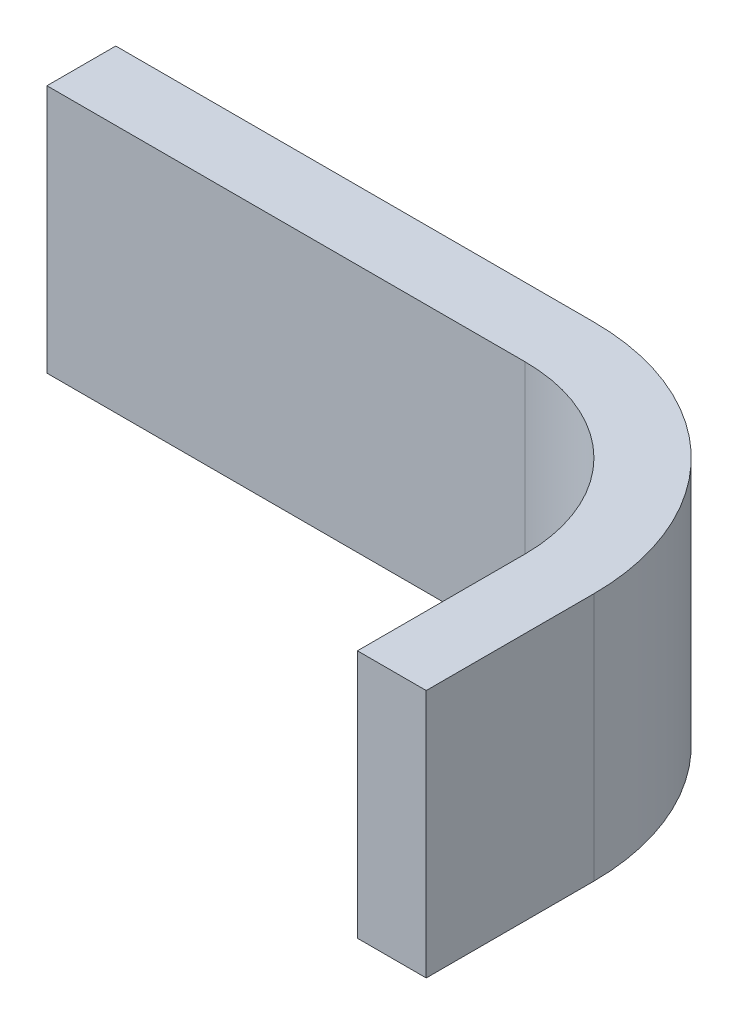
ISO-10303-21;
HEADER;
FILE_DESCRIPTION(('STEP AP214'),'2;1');
FILE_NAME('part.step','',(''),(''),'','','');
FILE_SCHEMA(('AUTOMOTIVE_DESIGN { 1 0 10303 214 1 1 1 1 }'));
ENDSEC;
DATA;
#1=APPLICATION_CONTEXT('core data for automotive mechanical design processes');
#2=APPLICATION_PROTOCOL_DEFINITION('international standard','automotive_design',2000,#1);
#3=PRODUCT_CONTEXT('',#1,'mechanical');
#4=PRODUCT('Part','Part','',(#3));
#5=PRODUCT_RELATED_PRODUCT_CATEGORY('part','',(#4));
#6=PRODUCT_DEFINITION_FORMATION('','',#4);
#7=PRODUCT_DEFINITION_CONTEXT('part definition',#1,'design');
#8=PRODUCT_DEFINITION('design','',#6,#7);
#9=PRODUCT_DEFINITION_SHAPE('','',#8);
#10=(LENGTH_UNIT() NAMED_UNIT(*) SI_UNIT(.MILLI.,.METRE.));
#11=(NAMED_UNIT(*) PLANE_ANGLE_UNIT() SI_UNIT($,.RADIAN.));
#12=(NAMED_UNIT(*) SI_UNIT($,.STERADIAN.) SOLID_ANGLE_UNIT());
#13=UNCERTAINTY_MEASURE_WITH_UNIT(LENGTH_MEASURE(1.E-05),#10,'distance_accuracy_value','');
#14=(GEOMETRIC_REPRESENTATION_CONTEXT(3) GLOBAL_UNCERTAINTY_ASSIGNED_CONTEXT((#13)) GLOBAL_UNIT_ASSIGNED_CONTEXT((#10,
#11,#12)) REPRESENTATION_CONTEXT('',''));
#15=CARTESIAN_POINT('',(0.,0.,0.));
#16=DIRECTION('',(0.,0.,1.));
#17=DIRECTION('',(1.,0.,0.));
#18=AXIS2_PLACEMENT_3D('',#15,#16,#17);
#19=CARTESIAN_POINT('',(0.,34.925,0.));
#20=DIRECTION('',(0.,0.,-1.));
#21=DIRECTION('',(-1.,0.,0.));
#22=AXIS2_PLACEMENT_3D('',#19,#20,#21);
#23=PLANE('',#22);
#24=DIRECTION('',(1.,0.,0.));
#25=VECTOR('',#24,1.);
#26=CARTESIAN_POINT('',(0.,0.,0.));
#27=LINE('',#26,#25);
#28=CARTESIAN_POINT('',(0.,0.,0.));
#29=VERTEX_POINT('',#28);
#30=CARTESIAN_POINT('',(67.05600012,0.,0.));
#31=VERTEX_POINT('',#30);
#32=EDGE_CURVE('E114',#29,#31,#27,.T.);
#33=ORIENTED_EDGE('',*,*,#32,.T.);
#34=DIRECTION('',(0.,-1.,0.));
#35=VECTOR('',#34,1.);
#36=CARTESIAN_POINT('',(67.05600012,34.925,0.));
#37=LINE('',#36,#35);
#38=CARTESIAN_POINT('',(67.05600012,34.925,0.));
#39=VERTEX_POINT('',#38);
#40=EDGE_CURVE('E11',#39,#31,#37,.T.);
#41=ORIENTED_EDGE('',*,*,#40,.F.);
#42=DIRECTION('',(1.,0.,0.));
#43=VECTOR('',#42,1.);
#44=CARTESIAN_POINT('',(0.,34.925,0.));
#45=LINE('',#44,#43);
#46=CARTESIAN_POINT('',(0.,34.925,0.));
#47=VERTEX_POINT('',#46);
#48=EDGE_CURVE('E133',#47,#39,#45,.T.);
#49=ORIENTED_EDGE('',*,*,#48,.F.);
#50=DIRECTION('',(0.,-1.,0.));
#51=VECTOR('',#50,1.);
#52=CARTESIAN_POINT('',(0.,34.925,0.));
#53=LINE('',#52,#51);
#54=EDGE_CURVE('E33',#47,#29,#53,.T.);
#55=ORIENTED_EDGE('',*,*,#54,.T.);
#56=EDGE_LOOP('',(#33,#41,#49,#55));
#57=FACE_BOUND('',#56,.T.);
#58=ADVANCED_FACE('F17',(#57),#23,.F.);
#59=CARTESIAN_POINT('',(67.05600012,34.925,23.368));
#60=DIRECTION('',(0.,-1.,0.));
#61=DIRECTION('',(0.,0.,-1.));
#62=AXIS2_PLACEMENT_3D('',#59,#60,#61);
#63=CYLINDRICAL_SURFACE('',#62,23.368);
#64=CARTESIAN_POINT('',(67.05600012,0.,23.368));
#65=DIRECTION('',(0.,1.,0.));
#66=DIRECTION('',(0.,0.,1.));
#67=AXIS2_PLACEMENT_3D('',#64,#65,#66);
#68=CIRCLE('',#67,23.368);
#69=CARTESIAN_POINT('',(90.42400012,0.,23.368));
#70=VERTEX_POINT('',#69);
#71=EDGE_CURVE('E116',#31,#70,#68,.F.);
#72=ORIENTED_EDGE('',*,*,#71,.T.);
#73=DIRECTION('',(0.,-1.,0.));
#74=VECTOR('',#73,1.);
#75=CARTESIAN_POINT('',(90.42400012,34.925,23.368));
#76=LINE('',#75,#74);
#77=CARTESIAN_POINT('',(90.42400012,34.925,23.368));
#78=VERTEX_POINT('',#77);
#79=EDGE_CURVE('E25',#78,#70,#76,.T.);
#80=ORIENTED_EDGE('',*,*,#79,.F.);
#81=CARTESIAN_POINT('',(67.05600012,34.925,23.368));
#82=DIRECTION('',(0.,1.,0.));
#83=DIRECTION('',(0.,0.,1.));
#84=AXIS2_PLACEMENT_3D('',#81,#82,#83);
#85=CIRCLE('',#84,23.368);
#86=EDGE_CURVE('E71',#39,#78,#85,.F.);
#87=ORIENTED_EDGE('',*,*,#86,.F.);
#88=ORIENTED_EDGE('',*,*,#40,.T.);
#89=EDGE_LOOP('',(#72,#80,#87,#88));
#90=FACE_BOUND('',#89,.T.);
#91=ADVANCED_FACE('F160',(#90),#63,.F.);
#92=CARTESIAN_POINT('',(90.42400012,34.925,0.));
#93=DIRECTION('',(1.,0.,0.));
#94=DIRECTION('',(0.,0.,-1.));
#95=AXIS2_PLACEMENT_3D('',#92,#93,#94);
#96=PLANE('',#95);
#97=DIRECTION('',(0.,0.,1.));
#98=VECTOR('',#97,1.);
#99=CARTESIAN_POINT('',(90.42400012,0.,0.));
#100=LINE('',#99,#98);
#101=CARTESIAN_POINT('',(90.42400012,0.,46.8722));
#102=VERTEX_POINT('',#101);
#103=EDGE_CURVE('E118',#70,#102,#100,.T.);
#104=ORIENTED_EDGE('',*,*,#103,.T.);
#105=DIRECTION('',(0.,-1.,0.));
#106=VECTOR('',#105,1.);
#107=CARTESIAN_POINT('',(90.42400012,34.925,46.8722));
#108=LINE('',#107,#106);
#109=CARTESIAN_POINT('',(90.42400012,34.925,46.8722));
#110=VERTEX_POINT('',#109);
#111=EDGE_CURVE('E139',#110,#102,#108,.T.);
#112=ORIENTED_EDGE('',*,*,#111,.F.);
#113=DIRECTION('',(0.,0.,1.));
#114=VECTOR('',#113,1.);
#115=CARTESIAN_POINT('',(90.42400012,34.925,0.));
#116=LINE('',#115,#114);
#117=EDGE_CURVE('E146',#78,#110,#116,.T.);
#118=ORIENTED_EDGE('',*,*,#117,.F.);
#119=ORIENTED_EDGE('',*,*,#79,.T.);
#120=EDGE_LOOP('',(#104,#112,#118,#119));
#121=FACE_BOUND('',#120,.T.);
#122=ADVANCED_FACE('F144',(#121),#96,.F.);
#123=CARTESIAN_POINT('',(0.,34.925,46.8722));
#124=DIRECTION('',(0.,0.,1.));
#125=DIRECTION('',(1.,0.,0.));
#126=AXIS2_PLACEMENT_3D('',#123,#124,#125);
#127=PLANE('',#126);
#128=DIRECTION('',(-1.,0.,0.));
#129=VECTOR('',#128,1.);
#130=CARTESIAN_POINT('',(0.,0.,46.8722));
#131=LINE('',#130,#129);
#132=CARTESIAN_POINT('',(100.07600012,0.,46.8722));
#133=VERTEX_POINT('',#132);
#134=EDGE_CURVE('E121',#133,#102,#131,.T.);
#135=ORIENTED_EDGE('',*,*,#134,.F.);
#136=DIRECTION('',(0.,-1.,0.));
#137=VECTOR('',#136,1.);
#138=CARTESIAN_POINT('',(100.07600012,34.925,46.8722));
#139=LINE('',#138,#137);
#140=CARTESIAN_POINT('',(100.07600012,34.925,46.8722));
#141=VERTEX_POINT('',#140);
#142=EDGE_CURVE('E137',#141,#133,#139,.T.);
#143=ORIENTED_EDGE('',*,*,#142,.F.);
#144=DIRECTION('',(-1.,0.,0.));
#145=VECTOR('',#144,1.);
#146=CARTESIAN_POINT('',(0.,34.925,46.8722));
#147=LINE('',#146,#145);
#148=EDGE_CURVE('E154',#141,#110,#147,.T.);
#149=ORIENTED_EDGE('',*,*,#148,.T.);
#150=ORIENTED_EDGE('',*,*,#111,.T.);
#151=EDGE_LOOP('',(#135,#143,#149,#150));
#152=FACE_BOUND('',#151,.T.);
#153=ADVANCED_FACE('F152',(#152),#127,.T.);
#154=CARTESIAN_POINT('',(100.07600012,34.925,0.));
#155=DIRECTION('',(1.,0.,0.));
#156=DIRECTION('',(0.,0.,-1.));
#157=AXIS2_PLACEMENT_3D('',#154,#155,#156);
#158=PLANE('',#157);
#159=DIRECTION('',(0.,0.,1.));
#160=VECTOR('',#159,1.);
#161=CARTESIAN_POINT('',(100.07600012,0.,0.));
#162=LINE('',#161,#160);
#163=CARTESIAN_POINT('',(100.07600012,0.,23.368));
#164=VERTEX_POINT('',#163);
#165=EDGE_CURVE('E124',#164,#133,#162,.T.);
#166=ORIENTED_EDGE('',*,*,#165,.F.);
#167=DIRECTION('',(0.,-1.,0.));
#168=VECTOR('',#167,1.);
#169=CARTESIAN_POINT('',(100.07600012,34.925,23.368));
#170=LINE('',#169,#168);
#171=CARTESIAN_POINT('',(100.07600012,34.925,23.368));
#172=VERTEX_POINT('',#171);
#173=EDGE_CURVE('E96',#172,#164,#170,.T.);
#174=ORIENTED_EDGE('',*,*,#173,.F.);
#175=DIRECTION('',(0.,0.,1.));
#176=VECTOR('',#175,1.);
#177=CARTESIAN_POINT('',(100.07600012,34.925,0.));
#178=LINE('',#177,#176);
#179=EDGE_CURVE('E106',#172,#141,#178,.T.);
#180=ORIENTED_EDGE('',*,*,#179,.T.);
#181=ORIENTED_EDGE('',*,*,#142,.T.);
#182=EDGE_LOOP('',(#166,#174,#180,#181));
#183=FACE_BOUND('',#182,.T.);
#184=ADVANCED_FACE('F172',(#183),#158,.T.);
#185=CARTESIAN_POINT('',(67.05600012,34.925,23.368));
#186=DIRECTION('',(0.,-1.,0.));
#187=DIRECTION('',(0.,0.,-1.));
#188=AXIS2_PLACEMENT_3D('',#185,#186,#187);
#189=CYLINDRICAL_SURFACE('',#188,33.02);
#190=CARTESIAN_POINT('',(67.05600012,0.,23.368));
#191=DIRECTION('',(0.,1.,0.));
#192=DIRECTION('',(0.,0.,1.));
#193=AXIS2_PLACEMENT_3D('',#190,#191,#192);
#194=CIRCLE('',#193,33.02);
#195=CARTESIAN_POINT('',(67.05600012,0.,-9.652));
#196=VERTEX_POINT('',#195);
#197=EDGE_CURVE('E92',#196,#164,#194,.F.);
#198=ORIENTED_EDGE('',*,*,#197,.F.);
#199=DIRECTION('',(0.,-1.,0.));
#200=VECTOR('',#199,1.);
#201=CARTESIAN_POINT('',(67.05600012,34.925,-9.652));
#202=LINE('',#201,#200);
#203=CARTESIAN_POINT('',(67.05600012,34.925,-9.652));
#204=VERTEX_POINT('',#203);
#205=EDGE_CURVE('E87',#204,#196,#202,.T.);
#206=ORIENTED_EDGE('',*,*,#205,.F.);
#207=CARTESIAN_POINT('',(67.05600012,34.925,23.368));
#208=DIRECTION('',(0.,1.,0.));
#209=DIRECTION('',(0.,0.,1.));
#210=AXIS2_PLACEMENT_3D('',#207,#208,#209);
#211=CIRCLE('',#210,33.02);
#212=EDGE_CURVE('E90',#204,#172,#211,.F.);
#213=ORIENTED_EDGE('',*,*,#212,.T.);
#214=ORIENTED_EDGE('',*,*,#173,.T.);
#215=EDGE_LOOP('',(#198,#206,#213,#214));
#216=FACE_BOUND('',#215,.T.);
#217=ADVANCED_FACE('F89',(#216),#189,.T.);
#218=CARTESIAN_POINT('',(0.,34.925,-9.652));
#219=DIRECTION('',(0.,0.,-1.));
#220=DIRECTION('',(-1.,0.,0.));
#221=AXIS2_PLACEMENT_3D('',#218,#219,#220);
#222=PLANE('',#221);
#223=DIRECTION('',(1.,0.,0.));
#224=VECTOR('',#223,1.);
#225=CARTESIAN_POINT('',(0.,0.,-9.652));
#226=LINE('',#225,#224);
#227=CARTESIAN_POINT('',(0.,0.,-9.652));
#228=VERTEX_POINT('',#227);
#229=EDGE_CURVE('E128',#228,#196,#226,.T.);
#230=ORIENTED_EDGE('',*,*,#229,.F.);
#231=DIRECTION('',(0.,-1.,0.));
#232=VECTOR('',#231,1.);
#233=CARTESIAN_POINT('',(0.,34.925,-9.652));
#234=LINE('',#233,#232);
#235=CARTESIAN_POINT('',(0.,34.925,-9.652));
#236=VERTEX_POINT('',#235);
#237=EDGE_CURVE('E59',#236,#228,#234,.T.);
#238=ORIENTED_EDGE('',*,*,#237,.F.);
#239=DIRECTION('',(1.,0.,0.));
#240=VECTOR('',#239,1.);
#241=CARTESIAN_POINT('',(0.,34.925,-9.652));
#242=LINE('',#241,#240);
#243=EDGE_CURVE('E103',#236,#204,#242,.T.);
#244=ORIENTED_EDGE('',*,*,#243,.T.);
#245=ORIENTED_EDGE('',*,*,#205,.T.);
#246=EDGE_LOOP('',(#230,#238,#244,#245));
#247=FACE_BOUND('',#246,.T.);
#248=ADVANCED_FACE('F108',(#247),#222,.T.);
#249=CARTESIAN_POINT('',(0.,34.925,0.));
#250=DIRECTION('',(-1.,0.,0.));
#251=DIRECTION('',(0.,0.,1.));
#252=AXIS2_PLACEMENT_3D('',#249,#250,#251);
#253=PLANE('',#252);
#254=DIRECTION('',(0.,0.,-1.));
#255=VECTOR('',#254,1.);
#256=CARTESIAN_POINT('',(0.,0.,0.));
#257=LINE('',#256,#255);
#258=EDGE_CURVE('E130',#29,#228,#257,.T.);
#259=ORIENTED_EDGE('',*,*,#258,.F.);
#260=ORIENTED_EDGE('',*,*,#54,.F.);
#261=DIRECTION('',(0.,0.,-1.));
#262=VECTOR('',#261,1.);
#263=CARTESIAN_POINT('',(0.,34.925,0.));
#264=LINE('',#263,#262);
#265=EDGE_CURVE('E109',#47,#236,#264,.T.);
#266=ORIENTED_EDGE('',*,*,#265,.T.);
#267=ORIENTED_EDGE('',*,*,#237,.T.);
#268=EDGE_LOOP('',(#259,#260,#266,#267));
#269=FACE_BOUND('',#268,.T.);
#270=ADVANCED_FACE('F180',(#269),#253,.T.);
#271=CARTESIAN_POINT('',(0.,34.925,0.));
#272=DIRECTION('',(0.,1.,0.));
#273=DIRECTION('',(0.,0.,1.));
#274=AXIS2_PLACEMENT_3D('',#271,#272,#273);
#275=PLANE('',#274);
#276=ORIENTED_EDGE('',*,*,#48,.T.);
#277=ORIENTED_EDGE('',*,*,#86,.T.);
#278=ORIENTED_EDGE('',*,*,#117,.T.);
#279=ORIENTED_EDGE('',*,*,#148,.F.);
#280=ORIENTED_EDGE('',*,*,#179,.F.);
#281=ORIENTED_EDGE('',*,*,#212,.F.);
#282=ORIENTED_EDGE('',*,*,#243,.F.);
#283=ORIENTED_EDGE('',*,*,#265,.F.);
#284=EDGE_LOOP('',(#276,#277,#278,#279,#280,#281,#282,#283));
#285=FACE_BOUND('',#284,.T.);
#286=ADVANCED_FACE('F101',(#285),#275,.T.);
#287=CARTESIAN_POINT('',(0.,0.,0.));
#288=DIRECTION('',(0.,1.,0.));
#289=DIRECTION('',(0.,0.,1.));
#290=AXIS2_PLACEMENT_3D('',#287,#288,#289);
#291=PLANE('',#290);
#292=ORIENTED_EDGE('',*,*,#32,.F.);
#293=ORIENTED_EDGE('',*,*,#258,.T.);
#294=ORIENTED_EDGE('',*,*,#229,.T.);
#295=ORIENTED_EDGE('',*,*,#197,.T.);
#296=ORIENTED_EDGE('',*,*,#165,.T.);
#297=ORIENTED_EDGE('',*,*,#134,.T.);
#298=ORIENTED_EDGE('',*,*,#103,.F.);
#299=ORIENTED_EDGE('',*,*,#71,.F.);
#300=EDGE_LOOP('',(#292,#293,#294,#295,#296,#297,#298,#299));
#301=FACE_BOUND('',#300,.T.);
#302=ADVANCED_FACE('F148',(#301),#291,.F.);
#303=CLOSED_SHELL('',(#58,#91,#122,#153,#184,#217,#248,#270,#286,#302));
#304=MANIFOLD_SOLID_BREP('B1',#303);
#305=ADVANCED_BREP_SHAPE_REPRESENTATION('',(#18,#304),#14);
#306=SHAPE_DEFINITION_REPRESENTATION(#9,#305);
ENDSEC;
END-ISO-10303-21;
